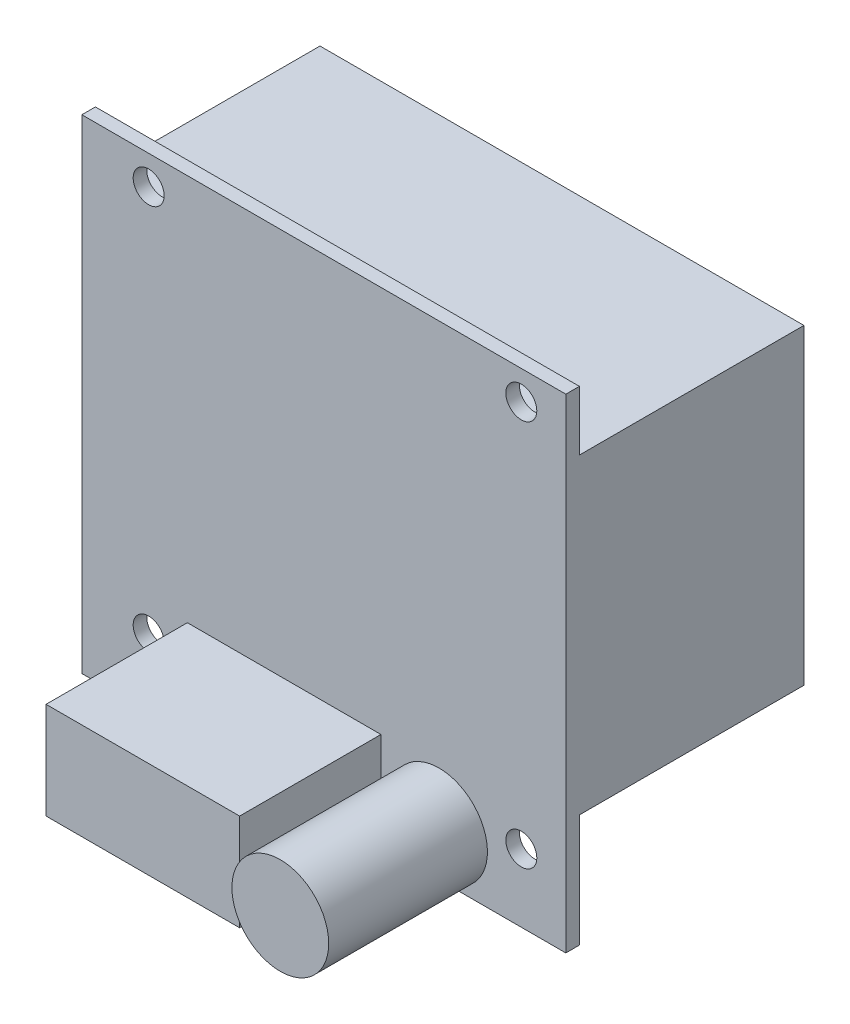
ISO-10303-21;
HEADER;
FILE_DESCRIPTION(('STEP AP214'),'2;1');
FILE_NAME('part.step','',(''),(''),'','','');
FILE_SCHEMA(('AUTOMOTIVE_DESIGN { 1 0 10303 214 1 1 1 1 }'));
ENDSEC;
DATA;
#1=APPLICATION_CONTEXT('core data for automotive mechanical design processes');
#2=APPLICATION_PROTOCOL_DEFINITION('international standard','automotive_design',2000,#1);
#3=PRODUCT_CONTEXT('',#1,'mechanical');
#4=PRODUCT('Part','Part','',(#3));
#5=PRODUCT_RELATED_PRODUCT_CATEGORY('part','',(#4));
#6=PRODUCT_DEFINITION_FORMATION('','',#4);
#7=PRODUCT_DEFINITION_CONTEXT('part definition',#1,'design');
#8=PRODUCT_DEFINITION('design','',#6,#7);
#9=PRODUCT_DEFINITION_SHAPE('','',#8);
#10=(LENGTH_UNIT() NAMED_UNIT(*) SI_UNIT(.MILLI.,.METRE.));
#11=(NAMED_UNIT(*) PLANE_ANGLE_UNIT() SI_UNIT($,.RADIAN.));
#12=(NAMED_UNIT(*) SI_UNIT($,.STERADIAN.) SOLID_ANGLE_UNIT());
#13=UNCERTAINTY_MEASURE_WITH_UNIT(LENGTH_MEASURE(1.E-05),#10,'distance_accuracy_value','');
#14=(GEOMETRIC_REPRESENTATION_CONTEXT(3) GLOBAL_UNCERTAINTY_ASSIGNED_CONTEXT((#13)) GLOBAL_UNIT_ASSIGNED_CONTEXT((#10,
#11,#12)) REPRESENTATION_CONTEXT('',''));
#15=CARTESIAN_POINT('',(0.,0.,0.));
#16=DIRECTION('',(0.,0.,1.));
#17=DIRECTION('',(1.,0.,0.));
#18=AXIS2_PLACEMENT_3D('',#15,#16,#17);
#19=CARTESIAN_POINT('',(0.,0.,1.4));
#20=DIRECTION('',(0.,0.,-1.));
#21=DIRECTION('',(-1.,0.,0.));
#22=AXIS2_PLACEMENT_3D('',#19,#20,#21);
#23=PLANE('',#22);
#24=CARTESIAN_POINT('',(20.4,22.,1.4));
#25=DIRECTION('',(0.,0.,1.));
#26=DIRECTION('',(1.,0.,0.));
#27=AXIS2_PLACEMENT_3D('',#24,#25,#26);
#28=CIRCLE('',#27,1.6);
#29=CARTESIAN_POINT('',(22.,22.,1.4));
#30=VERTEX_POINT('',#29);
#31=EDGE_CURVE('E184',#30,#30,#28,.T.);
#32=ORIENTED_EDGE('',*,*,#31,.F.);
#33=EDGE_LOOP('',(#32));
#34=FACE_BOUND('',#33,.T.);
#35=CARTESIAN_POINT('',(-18.1,-18.,1.4));
#36=DIRECTION('',(0.,0.,1.));
#37=DIRECTION('',(1.,0.,0.));
#38=AXIS2_PLACEMENT_3D('',#35,#36,#37);
#39=CIRCLE('',#38,1.6);
#40=CARTESIAN_POINT('',(-16.5,-18.,1.4));
#41=VERTEX_POINT('',#40);
#42=EDGE_CURVE('E470',#41,#41,#39,.T.);
#43=ORIENTED_EDGE('',*,*,#42,.F.);
#44=EDGE_LOOP('',(#43));
#45=FACE_BOUND('',#44,.T.);
#46=CARTESIAN_POINT('',(-18.1,22.,1.4));
#47=DIRECTION('',(0.,0.,1.));
#48=DIRECTION('',(1.,0.,0.));
#49=AXIS2_PLACEMENT_3D('',#46,#47,#48);
#50=CIRCLE('',#49,1.6);
#51=CARTESIAN_POINT('',(-16.5,22.,1.4));
#52=VERTEX_POINT('',#51);
#53=EDGE_CURVE('E192',#52,#52,#50,.T.);
#54=ORIENTED_EDGE('',*,*,#53,.F.);
#55=EDGE_LOOP('',(#54));
#56=FACE_BOUND('',#55,.T.);
#57=CARTESIAN_POINT('',(20.4,-18.,1.4));
#58=DIRECTION('',(0.,0.,1.));
#59=DIRECTION('',(1.,0.,0.));
#60=AXIS2_PLACEMENT_3D('',#57,#58,#59);
#61=CIRCLE('',#60,1.6);
#62=CARTESIAN_POINT('',(22.,-18.,1.4));
#63=VERTEX_POINT('',#62);
#64=EDGE_CURVE('E478',#63,#63,#61,.T.);
#65=ORIENTED_EDGE('',*,*,#64,.F.);
#66=EDGE_LOOP('',(#65));
#67=FACE_BOUND('',#66,.T.);
#68=DIRECTION('',(1.,0.,0.));
#69=VECTOR('',#68,1.);
#70=CARTESIAN_POINT('',(-25.,-25.,1.4));
#71=LINE('',#70,#69);
#72=CARTESIAN_POINT('',(5.9,-25.,1.4));
#73=VERTEX_POINT('',#72);
#74=CARTESIAN_POINT('',(11.9,-25.,1.4));
#75=VERTEX_POINT('',#74);
#76=EDGE_CURVE('E123',#73,#75,#71,.T.);
#77=ORIENTED_EDGE('',*,*,#76,.T.);
#78=CARTESIAN_POINT('',(11.9,-20.,1.4));
#79=DIRECTION('',(0.,0.,1.));
#80=DIRECTION('',(1.,0.,0.));
#81=AXIS2_PLACEMENT_3D('',#78,#79,#80);
#82=CIRCLE('',#81,5.);
#83=EDGE_CURVE('E126',#75,#75,#82,.T.);
#84=ORIENTED_EDGE('',*,*,#83,.F.);
#85=CARTESIAN_POINT('',(25.,-25.,1.4));
#86=VERTEX_POINT('',#85);
#87=EDGE_CURVE('E131',#75,#86,#71,.T.);
#88=ORIENTED_EDGE('',*,*,#87,.T.);
#89=DIRECTION('',(0.,1.,0.));
#90=VECTOR('',#89,1.);
#91=CARTESIAN_POINT('',(25.,-25.,1.4));
#92=LINE('',#91,#90);
#93=CARTESIAN_POINT('',(25.,25.,1.4));
#94=VERTEX_POINT('',#93);
#95=EDGE_CURVE('E174',#86,#94,#92,.T.);
#96=ORIENTED_EDGE('',*,*,#95,.T.);
#97=DIRECTION('',(-1.,0.,0.));
#98=VECTOR('',#97,1.);
#99=CARTESIAN_POINT('',(-25.,25.,1.4));
#100=LINE('',#99,#98);
#101=CARTESIAN_POINT('',(-25.,25.,1.4));
#102=VERTEX_POINT('',#101);
#103=EDGE_CURVE('E140',#94,#102,#100,.T.);
#104=ORIENTED_EDGE('',*,*,#103,.T.);
#105=DIRECTION('',(0.,-1.,0.));
#106=VECTOR('',#105,1.);
#107=CARTESIAN_POINT('',(-25.,-25.,1.4));
#108=LINE('',#107,#106);
#109=CARTESIAN_POINT('',(-25.,-25.,1.4));
#110=VERTEX_POINT('',#109);
#111=EDGE_CURVE('E139',#102,#110,#108,.T.);
#112=ORIENTED_EDGE('',*,*,#111,.T.);
#113=CARTESIAN_POINT('',(-14.1,-25.,1.4));
#114=VERTEX_POINT('',#113);
#115=EDGE_CURVE('E130',#110,#114,#71,.T.);
#116=ORIENTED_EDGE('',*,*,#115,.T.);
#117=DIRECTION('',(0.,-1.,0.));
#118=VECTOR('',#117,1.);
#119=CARTESIAN_POINT('',(-14.1,-18.,1.4));
#120=LINE('',#119,#118);
#121=CARTESIAN_POINT('',(-14.1,-15.,1.4));
#122=VERTEX_POINT('',#121);
#123=EDGE_CURVE('E49',#122,#114,#120,.T.);
#124=ORIENTED_EDGE('',*,*,#123,.F.);
#125=DIRECTION('',(-1.,0.,0.));
#126=VECTOR('',#125,1.);
#127=CARTESIAN_POINT('',(5.90000000000001,-15.,1.4));
#128=LINE('',#127,#126);
#129=CARTESIAN_POINT('',(5.90000000000001,-15.,1.4));
#130=VERTEX_POINT('',#129);
#131=EDGE_CURVE('E429',#130,#122,#128,.T.);
#132=ORIENTED_EDGE('',*,*,#131,.F.);
#133=DIRECTION('',(0.,1.,0.));
#134=VECTOR('',#133,1.);
#135=CARTESIAN_POINT('',(5.90000000000001,-25.,1.4));
#136=LINE('',#135,#134);
#137=EDGE_CURVE('E55',#73,#130,#136,.T.);
#138=ORIENTED_EDGE('',*,*,#137,.F.);
#139=EDGE_LOOP('',(#77,#84,#88,#96,#104,#112,#116,#124,#132,#138));
#140=FACE_BOUND('',#139,.T.);
#141=ADVANCED_FACE('F34',(#34,#45,#56,#67,#140),#23,.F.);
#142=CARTESIAN_POINT('',(0.,0.,0.));
#143=DIRECTION('',(0.,0.,-1.));
#144=DIRECTION('',(-1.,0.,0.));
#145=AXIS2_PLACEMENT_3D('',#142,#143,#144);
#146=PLANE('',#145);
#147=DIRECTION('',(-1.,0.,0.));
#148=VECTOR('',#147,1.);
#149=CARTESIAN_POINT('',(25.,-13.35,0.));
#150=LINE('',#149,#148);
#151=CARTESIAN_POINT('',(25.,-13.35,0.));
#152=VERTEX_POINT('',#151);
#153=CARTESIAN_POINT('',(-25.,-13.35,0.));
#154=VERTEX_POINT('',#153);
#155=EDGE_CURVE('E452',#152,#154,#150,.T.);
#156=ORIENTED_EDGE('',*,*,#155,.F.);
#157=DIRECTION('',(0.,1.,0.));
#158=VECTOR('',#157,1.);
#159=CARTESIAN_POINT('',(25.,-25.,0.));
#160=LINE('',#159,#158);
#161=CARTESIAN_POINT('',(25.,-25.,0.));
#162=VERTEX_POINT('',#161);
#163=EDGE_CURVE('E176',#162,#152,#160,.T.);
#164=ORIENTED_EDGE('',*,*,#163,.F.);
#165=DIRECTION('',(1.,0.,0.));
#166=VECTOR('',#165,1.);
#167=CARTESIAN_POINT('',(-25.,-25.,0.));
#168=LINE('',#167,#166);
#169=CARTESIAN_POINT('',(-25.,-25.,0.));
#170=VERTEX_POINT('',#169);
#171=EDGE_CURVE('E152',#170,#162,#168,.T.);
#172=ORIENTED_EDGE('',*,*,#171,.F.);
#173=DIRECTION('',(0.,-1.,0.));
#174=VECTOR('',#173,1.);
#175=CARTESIAN_POINT('',(-25.,-25.,0.));
#176=LINE('',#175,#174);
#177=EDGE_CURVE('E173',#154,#170,#176,.T.);
#178=ORIENTED_EDGE('',*,*,#177,.F.);
#179=EDGE_LOOP('',(#156,#164,#172,#178));
#180=FACE_BOUND('',#179,.T.);
#181=CARTESIAN_POINT('',(-18.1,-18.,0.));
#182=DIRECTION('',(0.,0.,1.));
#183=DIRECTION('',(1.,0.,0.));
#184=AXIS2_PLACEMENT_3D('',#181,#182,#183);
#185=CIRCLE('',#184,1.6);
#186=CARTESIAN_POINT('',(-16.5,-18.,0.));
#187=VERTEX_POINT('',#186);
#188=EDGE_CURVE('E471',#187,#187,#185,.T.);
#189=ORIENTED_EDGE('',*,*,#188,.T.);
#190=EDGE_LOOP('',(#189));
#191=FACE_BOUND('',#190,.T.);
#192=CARTESIAN_POINT('',(20.4,-18.,0.));
#193=DIRECTION('',(0.,0.,1.));
#194=DIRECTION('',(1.,0.,0.));
#195=AXIS2_PLACEMENT_3D('',#192,#193,#194);
#196=CIRCLE('',#195,1.6);
#197=CARTESIAN_POINT('',(22.,-18.,0.));
#198=VERTEX_POINT('',#197);
#199=EDGE_CURVE('E189',#198,#198,#196,.T.);
#200=ORIENTED_EDGE('',*,*,#199,.T.);
#201=EDGE_LOOP('',(#200));
#202=FACE_BOUND('',#201,.T.);
#203=ADVANCED_FACE('F198',(#180,#191,#202),#146,.T.);
#204=CARTESIAN_POINT('',(25.,-25.,1.4));
#205=DIRECTION('',(-1.,0.,0.));
#206=DIRECTION('',(0.,0.,1.));
#207=AXIS2_PLACEMENT_3D('',#204,#205,#206);
#208=PLANE('',#207);
#209=ORIENTED_EDGE('',*,*,#163,.T.);
#210=DIRECTION('',(0.,0.,1.));
#211=VECTOR('',#210,1.);
#212=CARTESIAN_POINT('',(25.,-13.35,-23.2));
#213=LINE('',#212,#211);
#214=CARTESIAN_POINT('',(25.,-13.35,-23.2));
#215=VERTEX_POINT('',#214);
#216=EDGE_CURVE('E464',#215,#152,#213,.T.);
#217=ORIENTED_EDGE('',*,*,#216,.F.);
#218=DIRECTION('',(0.,-1.,0.));
#219=VECTOR('',#218,1.);
#220=CARTESIAN_POINT('',(25.,18.85,-23.2));
#221=LINE('',#220,#219);
#222=CARTESIAN_POINT('',(25.,18.85,-23.2));
#223=VERTEX_POINT('',#222);
#224=EDGE_CURVE('E454',#223,#215,#221,.T.);
#225=ORIENTED_EDGE('',*,*,#224,.F.);
#226=DIRECTION('',(0.,0.,1.));
#227=VECTOR('',#226,1.);
#228=CARTESIAN_POINT('',(25.,18.85,-23.2));
#229=LINE('',#228,#227);
#230=CARTESIAN_POINT('',(25.,18.85,0.));
#231=VERTEX_POINT('',#230);
#232=EDGE_CURVE('E466',#223,#231,#229,.T.);
#233=ORIENTED_EDGE('',*,*,#232,.T.);
#234=CARTESIAN_POINT('',(25.,25.,0.));
#235=VERTEX_POINT('',#234);
#236=EDGE_CURVE('E177',#231,#235,#160,.T.);
#237=ORIENTED_EDGE('',*,*,#236,.T.);
#238=DIRECTION('',(0.,0.,-1.));
#239=VECTOR('',#238,1.);
#240=CARTESIAN_POINT('',(25.,25.,1.4));
#241=LINE('',#240,#239);
#242=EDGE_CURVE('E11',#94,#235,#241,.T.);
#243=ORIENTED_EDGE('',*,*,#242,.F.);
#244=ORIENTED_EDGE('',*,*,#95,.F.);
#245=DIRECTION('',(0.,0.,-1.));
#246=VECTOR('',#245,1.);
#247=CARTESIAN_POINT('',(25.,-25.,1.4));
#248=LINE('',#247,#246);
#249=EDGE_CURVE('E136',#86,#162,#248,.T.);
#250=ORIENTED_EDGE('',*,*,#249,.T.);
#251=EDGE_LOOP('',(#209,#217,#225,#233,#237,#243,#244,#250));
#252=FACE_BOUND('',#251,.T.);
#253=ADVANCED_FACE('F36',(#252),#208,.F.);
#254=CARTESIAN_POINT('',(-25.,25.,1.4));
#255=DIRECTION('',(0.,-1.,0.));
#256=DIRECTION('',(0.,0.,-1.));
#257=AXIS2_PLACEMENT_3D('',#254,#255,#256);
#258=PLANE('',#257);
#259=DIRECTION('',(-1.,0.,0.));
#260=VECTOR('',#259,1.);
#261=CARTESIAN_POINT('',(-25.,25.,0.));
#262=LINE('',#261,#260);
#263=CARTESIAN_POINT('',(-25.,25.,0.));
#264=VERTEX_POINT('',#263);
#265=EDGE_CURVE('E170',#235,#264,#262,.T.);
#266=ORIENTED_EDGE('',*,*,#265,.T.);
#267=DIRECTION('',(0.,0.,-1.));
#268=VECTOR('',#267,1.);
#269=CARTESIAN_POINT('',(-25.,25.,1.4));
#270=LINE('',#269,#268);
#271=EDGE_CURVE('E42',#102,#264,#270,.T.);
#272=ORIENTED_EDGE('',*,*,#271,.F.);
#273=ORIENTED_EDGE('',*,*,#103,.F.);
#274=ORIENTED_EDGE('',*,*,#242,.T.);
#275=EDGE_LOOP('',(#266,#272,#273,#274));
#276=FACE_BOUND('',#275,.T.);
#277=ADVANCED_FACE('F196',(#276),#258,.F.);
#278=CARTESIAN_POINT('',(-25.,-25.,1.4));
#279=DIRECTION('',(1.,0.,0.));
#280=DIRECTION('',(0.,0.,-1.));
#281=AXIS2_PLACEMENT_3D('',#278,#279,#280);
#282=PLANE('',#281);
#283=CARTESIAN_POINT('',(-25.,18.85,0.));
#284=VERTEX_POINT('',#283);
#285=EDGE_CURVE('E162',#264,#284,#176,.T.);
#286=ORIENTED_EDGE('',*,*,#285,.T.);
#287=DIRECTION('',(0.,0.,1.));
#288=VECTOR('',#287,1.);
#289=CARTESIAN_POINT('',(-25.,18.85,-23.2));
#290=LINE('',#289,#288);
#291=CARTESIAN_POINT('',(-25.,18.85,-23.2));
#292=VERTEX_POINT('',#291);
#293=EDGE_CURVE('E468',#292,#284,#290,.T.);
#294=ORIENTED_EDGE('',*,*,#293,.F.);
#295=DIRECTION('',(0.,1.,0.));
#296=VECTOR('',#295,1.);
#297=CARTESIAN_POINT('',(-25.,18.85,-23.2));
#298=LINE('',#297,#296);
#299=CARTESIAN_POINT('',(-25.,-13.35,-23.2));
#300=VERTEX_POINT('',#299);
#301=EDGE_CURVE('E448',#300,#292,#298,.T.);
#302=ORIENTED_EDGE('',*,*,#301,.F.);
#303=DIRECTION('',(0.,0.,1.));
#304=VECTOR('',#303,1.);
#305=CARTESIAN_POINT('',(-25.,-13.35,-23.2));
#306=LINE('',#305,#304);
#307=EDGE_CURVE('E458',#300,#154,#306,.T.);
#308=ORIENTED_EDGE('',*,*,#307,.T.);
#309=ORIENTED_EDGE('',*,*,#177,.T.);
#310=DIRECTION('',(0.,0.,-1.));
#311=VECTOR('',#310,1.);
#312=CARTESIAN_POINT('',(-25.,-25.,1.4));
#313=LINE('',#312,#311);
#314=EDGE_CURVE('E144',#110,#170,#313,.T.);
#315=ORIENTED_EDGE('',*,*,#314,.F.);
#316=ORIENTED_EDGE('',*,*,#111,.F.);
#317=ORIENTED_EDGE('',*,*,#271,.T.);
#318=EDGE_LOOP('',(#286,#294,#302,#308,#309,#315,#316,#317));
#319=FACE_BOUND('',#318,.T.);
#320=ADVANCED_FACE('F160',(#319),#282,.F.);
#321=CARTESIAN_POINT('',(-25.,-25.,1.4));
#322=DIRECTION('',(0.,1.,0.));
#323=DIRECTION('',(0.,0.,1.));
#324=AXIS2_PLACEMENT_3D('',#321,#322,#323);
#325=PLANE('',#324);
#326=ORIENTED_EDGE('',*,*,#171,.T.);
#327=ORIENTED_EDGE('',*,*,#249,.F.);
#328=ORIENTED_EDGE('',*,*,#87,.F.);
#329=ORIENTED_EDGE('',*,*,#76,.F.);
#330=DIRECTION('',(0.,0.,-1.));
#331=VECTOR('',#330,1.);
#332=CARTESIAN_POINT('',(5.90000000000001,-25.,16.));
#333=LINE('',#332,#331);
#334=CARTESIAN_POINT('',(5.90000000000001,-25.,16.));
#335=VERTEX_POINT('',#334);
#336=EDGE_CURVE('E443',#335,#73,#333,.T.);
#337=ORIENTED_EDGE('',*,*,#336,.F.);
#338=DIRECTION('',(1.,0.,0.));
#339=VECTOR('',#338,1.);
#340=CARTESIAN_POINT('',(-14.1,-25.,16.));
#341=LINE('',#340,#339);
#342=CARTESIAN_POINT('',(-14.1,-25.,16.));
#343=VERTEX_POINT('',#342);
#344=EDGE_CURVE('E428',#343,#335,#341,.T.);
#345=ORIENTED_EDGE('',*,*,#344,.F.);
#346=DIRECTION('',(0.,0.,-1.));
#347=VECTOR('',#346,1.);
#348=CARTESIAN_POINT('',(-14.1,-25.,16.));
#349=LINE('',#348,#347);
#350=EDGE_CURVE('E445',#343,#114,#349,.T.);
#351=ORIENTED_EDGE('',*,*,#350,.T.);
#352=ORIENTED_EDGE('',*,*,#115,.F.);
#353=ORIENTED_EDGE('',*,*,#314,.T.);
#354=EDGE_LOOP('',(#326,#327,#328,#329,#337,#345,#351,#352,#353));
#355=FACE_BOUND('',#354,.T.);
#356=ADVANCED_FACE('F134',(#355),#325,.F.);
#357=DIRECTION('',(1.,0.,0.));
#358=VECTOR('',#357,1.);
#359=CARTESIAN_POINT('',(25.,18.85,0.));
#360=LINE('',#359,#358);
#361=EDGE_CURVE('E172',#284,#231,#360,.T.);
#362=ORIENTED_EDGE('',*,*,#361,.F.);
#363=ORIENTED_EDGE('',*,*,#285,.F.);
#364=ORIENTED_EDGE('',*,*,#265,.F.);
#365=ORIENTED_EDGE('',*,*,#236,.F.);
#366=EDGE_LOOP('',(#362,#363,#364,#365));
#367=FACE_BOUND('',#366,.T.);
#368=CARTESIAN_POINT('',(-18.1,22.,0.));
#369=DIRECTION('',(0.,0.,1.));
#370=DIRECTION('',(1.,0.,0.));
#371=AXIS2_PLACEMENT_3D('',#368,#369,#370);
#372=CIRCLE('',#371,1.6);
#373=CARTESIAN_POINT('',(-16.5,22.,0.));
#374=VERTEX_POINT('',#373);
#375=EDGE_CURVE('E480',#374,#374,#372,.T.);
#376=ORIENTED_EDGE('',*,*,#375,.T.);
#377=EDGE_LOOP('',(#376));
#378=FACE_BOUND('',#377,.T.);
#379=CARTESIAN_POINT('',(20.4,22.,0.));
#380=DIRECTION('',(0.,0.,1.));
#381=DIRECTION('',(1.,0.,0.));
#382=AXIS2_PLACEMENT_3D('',#379,#380,#381);
#383=CIRCLE('',#382,1.6);
#384=CARTESIAN_POINT('',(22.,22.,0.));
#385=VERTEX_POINT('',#384);
#386=EDGE_CURVE('E180',#385,#385,#383,.T.);
#387=ORIENTED_EDGE('',*,*,#386,.T.);
#388=EDGE_LOOP('',(#387));
#389=FACE_BOUND('',#388,.T.);
#390=ADVANCED_FACE('F168',(#367,#378,#389),#146,.T.);
#391=CARTESIAN_POINT('',(20.4,22.,0.));
#392=DIRECTION('',(0.,0.,1.));
#393=DIRECTION('',(1.,0.,0.));
#394=AXIS2_PLACEMENT_3D('',#391,#392,#393);
#395=CYLINDRICAL_SURFACE('',#394,1.6);
#396=ORIENTED_EDGE('',*,*,#386,.F.);
#397=EDGE_LOOP('',(#396));
#398=FACE_BOUND('',#397,.T.);
#399=ORIENTED_EDGE('',*,*,#31,.T.);
#400=EDGE_LOOP('',(#399));
#401=FACE_BOUND('',#400,.T.);
#402=ADVANCED_FACE('F213',(#398,#401),#395,.F.);
#403=CARTESIAN_POINT('',(-18.1,-18.,0.));
#404=DIRECTION('',(0.,0.,1.));
#405=DIRECTION('',(1.,0.,0.));
#406=AXIS2_PLACEMENT_3D('',#403,#404,#405);
#407=CYLINDRICAL_SURFACE('',#406,1.6);
#408=ORIENTED_EDGE('',*,*,#188,.F.);
#409=EDGE_LOOP('',(#408));
#410=FACE_BOUND('',#409,.T.);
#411=ORIENTED_EDGE('',*,*,#42,.T.);
#412=EDGE_LOOP('',(#411));
#413=FACE_BOUND('',#412,.T.);
#414=ADVANCED_FACE('F242',(#410,#413),#407,.F.);
#415=CARTESIAN_POINT('',(-18.1,22.,0.));
#416=DIRECTION('',(0.,0.,1.));
#417=DIRECTION('',(1.,0.,0.));
#418=AXIS2_PLACEMENT_3D('',#415,#416,#417);
#419=CYLINDRICAL_SURFACE('',#418,1.6);
#420=ORIENTED_EDGE('',*,*,#375,.F.);
#421=EDGE_LOOP('',(#420));
#422=FACE_BOUND('',#421,.T.);
#423=ORIENTED_EDGE('',*,*,#53,.T.);
#424=EDGE_LOOP('',(#423));
#425=FACE_BOUND('',#424,.T.);
#426=ADVANCED_FACE('F249',(#422,#425),#419,.F.);
#427=CARTESIAN_POINT('',(20.4,-18.,0.));
#428=DIRECTION('',(0.,0.,1.));
#429=DIRECTION('',(1.,0.,0.));
#430=AXIS2_PLACEMENT_3D('',#427,#428,#429);
#431=CYLINDRICAL_SURFACE('',#430,1.6);
#432=ORIENTED_EDGE('',*,*,#199,.F.);
#433=EDGE_LOOP('',(#432));
#434=FACE_BOUND('',#433,.T.);
#435=ORIENTED_EDGE('',*,*,#64,.T.);
#436=EDGE_LOOP('',(#435));
#437=FACE_BOUND('',#436,.T.);
#438=ADVANCED_FACE('F257',(#434,#437),#431,.F.);
#439=CARTESIAN_POINT('',(25.,18.85,-23.2));
#440=DIRECTION('',(0.,-1.,0.));
#441=DIRECTION('',(0.,0.,-1.));
#442=AXIS2_PLACEMENT_3D('',#439,#440,#441);
#443=PLANE('',#442);
#444=ORIENTED_EDGE('',*,*,#361,.T.);
#445=ORIENTED_EDGE('',*,*,#232,.F.);
#446=DIRECTION('',(1.,0.,0.));
#447=VECTOR('',#446,1.);
#448=CARTESIAN_POINT('',(25.,18.85,-23.2));
#449=LINE('',#448,#447);
#450=EDGE_CURVE('E451',#292,#223,#449,.T.);
#451=ORIENTED_EDGE('',*,*,#450,.F.);
#452=ORIENTED_EDGE('',*,*,#293,.T.);
#453=EDGE_LOOP('',(#444,#445,#451,#452));
#454=FACE_BOUND('',#453,.T.);
#455=ADVANCED_FACE('F264',(#454),#443,.F.);
#456=CARTESIAN_POINT('',(25.,-13.35,-23.2));
#457=DIRECTION('',(0.,1.,0.));
#458=DIRECTION('',(0.,0.,1.));
#459=AXIS2_PLACEMENT_3D('',#456,#457,#458);
#460=PLANE('',#459);
#461=ORIENTED_EDGE('',*,*,#155,.T.);
#462=ORIENTED_EDGE('',*,*,#307,.F.);
#463=DIRECTION('',(-1.,0.,0.));
#464=VECTOR('',#463,1.);
#465=CARTESIAN_POINT('',(25.,-13.35,-23.2));
#466=LINE('',#465,#464);
#467=EDGE_CURVE('E456',#215,#300,#466,.T.);
#468=ORIENTED_EDGE('',*,*,#467,.F.);
#469=ORIENTED_EDGE('',*,*,#216,.T.);
#470=EDGE_LOOP('',(#461,#462,#468,#469));
#471=FACE_BOUND('',#470,.T.);
#472=ADVANCED_FACE('F273',(#471),#460,.F.);
#473=CARTESIAN_POINT('',(0.,0.,-23.2));
#474=DIRECTION('',(0.,0.,-1.));
#475=DIRECTION('',(-1.,0.,0.));
#476=AXIS2_PLACEMENT_3D('',#473,#474,#475);
#477=PLANE('',#476);
#478=ORIENTED_EDGE('',*,*,#301,.T.);
#479=ORIENTED_EDGE('',*,*,#450,.T.);
#480=ORIENTED_EDGE('',*,*,#224,.T.);
#481=ORIENTED_EDGE('',*,*,#467,.T.);
#482=EDGE_LOOP('',(#478,#479,#480,#481));
#483=FACE_BOUND('',#482,.T.);
#484=ADVANCED_FACE('F280',(#483),#477,.T.);
#485=CARTESIAN_POINT('',(-14.1,-18.,16.));
#486=DIRECTION('',(1.,0.,0.));
#487=DIRECTION('',(0.,1.,0.));
#488=AXIS2_PLACEMENT_3D('',#485,#486,#487);
#489=PLANE('',#488);
#490=ORIENTED_EDGE('',*,*,#123,.T.);
#491=ORIENTED_EDGE('',*,*,#350,.F.);
#492=DIRECTION('',(0.,-1.,0.));
#493=VECTOR('',#492,1.);
#494=CARTESIAN_POINT('',(-14.1,-15.,16.));
#495=LINE('',#494,#493);
#496=CARTESIAN_POINT('',(-14.1,-15.,16.));
#497=VERTEX_POINT('',#496);
#498=EDGE_CURVE('E426',#497,#343,#495,.T.);
#499=ORIENTED_EDGE('',*,*,#498,.F.);
#500=DIRECTION('',(0.,0.,-1.));
#501=VECTOR('',#500,1.);
#502=CARTESIAN_POINT('',(-14.1,-15.,16.));
#503=LINE('',#502,#501);
#504=EDGE_CURVE('E434',#497,#122,#503,.T.);
#505=ORIENTED_EDGE('',*,*,#504,.T.);
#506=EDGE_LOOP('',(#490,#491,#499,#505));
#507=FACE_BOUND('',#506,.T.);
#508=ADVANCED_FACE('F287',(#507),#489,.F.);
#509=CARTESIAN_POINT('',(5.90000000000001,-25.,16.));
#510=DIRECTION('',(-1.,0.,0.));
#511=DIRECTION('',(0.,0.,1.));
#512=AXIS2_PLACEMENT_3D('',#509,#510,#511);
#513=PLANE('',#512);
#514=ORIENTED_EDGE('',*,*,#137,.T.);
#515=DIRECTION('',(0.,0.,-1.));
#516=VECTOR('',#515,1.);
#517=CARTESIAN_POINT('',(5.90000000000001,-15.,16.));
#518=LINE('',#517,#516);
#519=CARTESIAN_POINT('',(5.90000000000001,-15.,16.));
#520=VERTEX_POINT('',#519);
#521=EDGE_CURVE('E440',#520,#130,#518,.T.);
#522=ORIENTED_EDGE('',*,*,#521,.F.);
#523=DIRECTION('',(0.,1.,0.));
#524=VECTOR('',#523,1.);
#525=CARTESIAN_POINT('',(5.90000000000001,-25.,16.));
#526=LINE('',#525,#524);
#527=EDGE_CURVE('E431',#335,#520,#526,.T.);
#528=ORIENTED_EDGE('',*,*,#527,.F.);
#529=ORIENTED_EDGE('',*,*,#336,.T.);
#530=EDGE_LOOP('',(#514,#522,#528,#529));
#531=FACE_BOUND('',#530,.T.);
#532=ADVANCED_FACE('F295',(#531),#513,.F.);
#533=CARTESIAN_POINT('',(5.90000000000001,-15.,16.));
#534=DIRECTION('',(0.,-1.,0.));
#535=DIRECTION('',(1.,0.,0.));
#536=AXIS2_PLACEMENT_3D('',#533,#534,#535);
#537=PLANE('',#536);
#538=ORIENTED_EDGE('',*,*,#131,.T.);
#539=ORIENTED_EDGE('',*,*,#504,.F.);
#540=DIRECTION('',(-1.,0.,0.));
#541=VECTOR('',#540,1.);
#542=CARTESIAN_POINT('',(5.90000000000001,-15.,16.));
#543=LINE('',#542,#541);
#544=EDGE_CURVE('E433',#520,#497,#543,.T.);
#545=ORIENTED_EDGE('',*,*,#544,.F.);
#546=ORIENTED_EDGE('',*,*,#521,.T.);
#547=EDGE_LOOP('',(#538,#539,#545,#546));
#548=FACE_BOUND('',#547,.T.);
#549=ADVANCED_FACE('F303',(#548),#537,.F.);
#550=CARTESIAN_POINT('',(0.,0.,16.));
#551=DIRECTION('',(0.,0.,1.));
#552=DIRECTION('',(1.,0.,0.));
#553=AXIS2_PLACEMENT_3D('',#550,#551,#552);
#554=PLANE('',#553);
#555=ORIENTED_EDGE('',*,*,#498,.T.);
#556=ORIENTED_EDGE('',*,*,#344,.T.);
#557=ORIENTED_EDGE('',*,*,#527,.T.);
#558=ORIENTED_EDGE('',*,*,#544,.T.);
#559=EDGE_LOOP('',(#555,#556,#557,#558));
#560=FACE_BOUND('',#559,.T.);
#561=ADVANCED_FACE('F310',(#560),#554,.T.);
#562=CARTESIAN_POINT('',(11.9,-20.,17.8));
#563=DIRECTION('',(0.,0.,-1.));
#564=DIRECTION('',(-1.,0.,0.));
#565=AXIS2_PLACEMENT_3D('',#562,#563,#564);
#566=CYLINDRICAL_SURFACE('',#565,5.);
#567=CARTESIAN_POINT('',(11.9,-20.,17.8));
#568=DIRECTION('',(0.,0.,1.));
#569=DIRECTION('',(1.,0.,0.));
#570=AXIS2_PLACEMENT_3D('',#567,#568,#569);
#571=CIRCLE('',#570,5.);
#572=CARTESIAN_POINT('',(16.9,-20.,17.8));
#573=VERTEX_POINT('',#572);
#574=EDGE_CURVE('E421',#573,#573,#571,.T.);
#575=ORIENTED_EDGE('',*,*,#574,.F.);
#576=EDGE_LOOP('',(#575));
#577=FACE_BOUND('',#576,.T.);
#578=ORIENTED_EDGE('',*,*,#83,.T.);
#579=EDGE_LOOP('',(#578));
#580=FACE_BOUND('',#579,.T.);
#581=ADVANCED_FACE('F317',(#577,#580),#566,.T.);
#582=CARTESIAN_POINT('',(11.9,-20.,17.8));
#583=DIRECTION('',(0.,0.,1.));
#584=DIRECTION('',(1.,0.,0.));
#585=AXIS2_PLACEMENT_3D('',#582,#583,#584);
#586=PLANE('',#585);
#587=ORIENTED_EDGE('',*,*,#574,.T.);
#588=EDGE_LOOP('',(#587));
#589=FACE_BOUND('',#588,.T.);
#590=ADVANCED_FACE('F325',(#589),#586,.T.);
#591=CLOSED_SHELL('',(#141,#203,#253,#277,#320,#356,#390,#402,#414,#426,#438,#455,#472,#484,
#508,#532,#549,#561,#581,#590));
#592=MANIFOLD_SOLID_BREP('B2',#591);
#593=ADVANCED_BREP_SHAPE_REPRESENTATION('',(#18,#592),#14);
#594=SHAPE_DEFINITION_REPRESENTATION(#9,#593);
ENDSEC;
END-ISO-10303-21;
